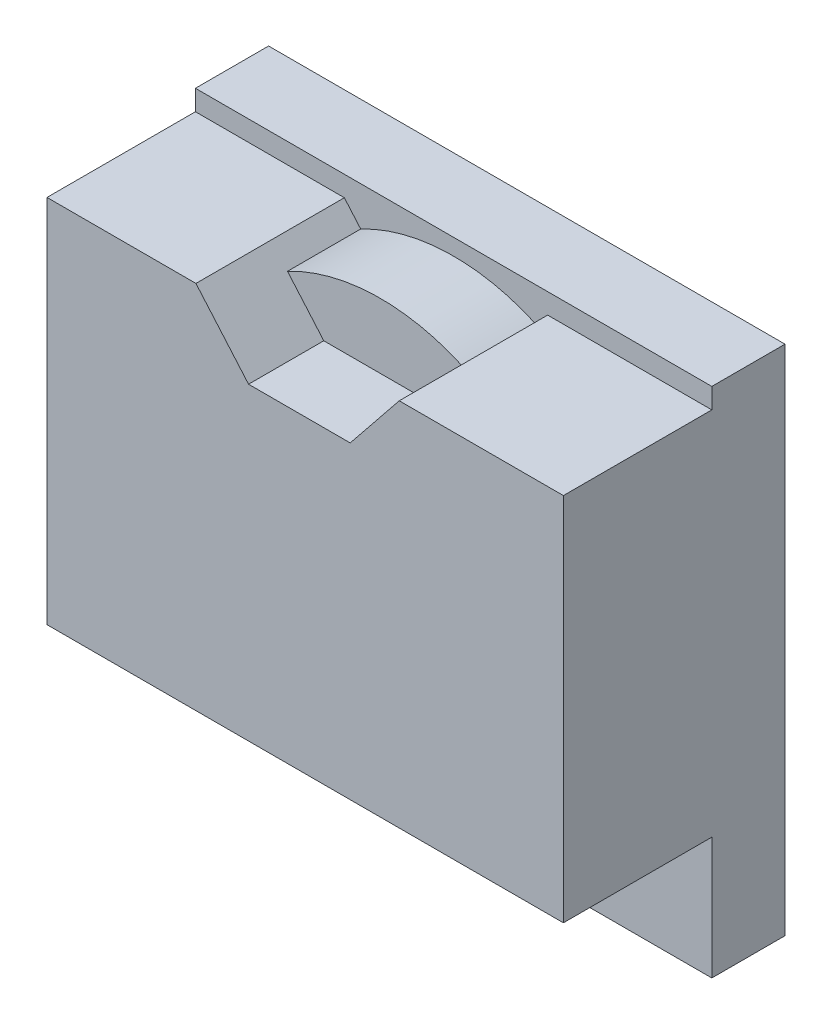
ISO-10303-21;
HEADER;
FILE_DESCRIPTION(('STEP AP214'),'2;1');
FILE_NAME('part.step','',(''),(''),'','','');
FILE_SCHEMA(('AUTOMOTIVE_DESIGN { 1 0 10303 214 1 1 1 1 }'));
ENDSEC;
DATA;
#1=APPLICATION_CONTEXT('core data for automotive mechanical design processes');
#2=APPLICATION_PROTOCOL_DEFINITION('international standard','automotive_design',2000,#1);
#3=PRODUCT_CONTEXT('',#1,'mechanical');
#4=PRODUCT('Part','Part','',(#3));
#5=PRODUCT_RELATED_PRODUCT_CATEGORY('part','',(#4));
#6=PRODUCT_DEFINITION_FORMATION('','',#4);
#7=PRODUCT_DEFINITION_CONTEXT('part definition',#1,'design');
#8=PRODUCT_DEFINITION('design','',#6,#7);
#9=PRODUCT_DEFINITION_SHAPE('','',#8);
#10=(LENGTH_UNIT() NAMED_UNIT(*) SI_UNIT(.MILLI.,.METRE.));
#11=(NAMED_UNIT(*) PLANE_ANGLE_UNIT() SI_UNIT($,.RADIAN.));
#12=(NAMED_UNIT(*) SI_UNIT($,.STERADIAN.) SOLID_ANGLE_UNIT());
#13=UNCERTAINTY_MEASURE_WITH_UNIT(LENGTH_MEASURE(1.E-05),#10,'distance_accuracy_value','');
#14=(GEOMETRIC_REPRESENTATION_CONTEXT(3) GLOBAL_UNCERTAINTY_ASSIGNED_CONTEXT((#13)) GLOBAL_UNIT_ASSIGNED_CONTEXT((#10,
#11,#12)) REPRESENTATION_CONTEXT('',''));
#15=CARTESIAN_POINT('',(0.,0.,0.));
#16=DIRECTION('',(0.,0.,1.));
#17=DIRECTION('',(1.,0.,0.));
#18=AXIS2_PLACEMENT_3D('',#15,#16,#17);
#19=CARTESIAN_POINT('',(6.35,-6.3,0.));
#20=DIRECTION('',(0.,-1.,0.));
#21=DIRECTION('',(0.,0.,-1.));
#22=AXIS2_PLACEMENT_3D('',#19,#20,#21);
#23=PLANE('',#22);
#24=DIRECTION('',(-1.,0.,0.));
#25=VECTOR('',#24,1.);
#26=CARTESIAN_POINT('',(-6.35,-6.3,0.9));
#27=LINE('',#26,#25);
#28=CARTESIAN_POINT('',(6.35,-6.3,0.9));
#29=VERTEX_POINT('',#28);
#30=CARTESIAN_POINT('',(-6.35,-6.3,0.9));
#31=VERTEX_POINT('',#30);
#32=EDGE_CURVE('E132',#29,#31,#27,.T.);
#33=ORIENTED_EDGE('',*,*,#32,.T.);
#34=DIRECTION('',(0.,0.,-1.));
#35=VECTOR('',#34,1.);
#36=CARTESIAN_POINT('',(-6.35,-6.3,0.));
#37=LINE('',#36,#35);
#38=CARTESIAN_POINT('',(-6.35,-6.3,-0.9));
#39=VERTEX_POINT('',#38);
#40=EDGE_CURVE('E124',#31,#39,#37,.T.);
#41=ORIENTED_EDGE('',*,*,#40,.T.);
#42=DIRECTION('',(1.,0.,0.));
#43=VECTOR('',#42,1.);
#44=CARTESIAN_POINT('',(-6.35,-6.3,-0.9));
#45=LINE('',#44,#43);
#46=CARTESIAN_POINT('',(6.35,-6.3,-0.9));
#47=VERTEX_POINT('',#46);
#48=EDGE_CURVE('E112',#39,#47,#45,.T.);
#49=ORIENTED_EDGE('',*,*,#48,.T.);
#50=DIRECTION('',(0.,0.,1.));
#51=VECTOR('',#50,1.);
#52=CARTESIAN_POINT('',(6.35,-6.3,0.));
#53=LINE('',#52,#51);
#54=EDGE_CURVE('E101',#47,#29,#53,.T.);
#55=ORIENTED_EDGE('',*,*,#54,.T.);
#56=EDGE_LOOP('',(#33,#41,#49,#55));
#57=FACE_BOUND('',#56,.T.);
#58=ADVANCED_FACE('F15',(#57),#23,.T.);
#59=CARTESIAN_POINT('',(-6.35,6.3,0.));
#60=DIRECTION('',(0.,1.,0.));
#61=DIRECTION('',(0.,0.,1.));
#62=AXIS2_PLACEMENT_3D('',#59,#60,#61);
#63=PLANE('',#62);
#64=DIRECTION('',(1.,0.,0.));
#65=VECTOR('',#64,1.);
#66=CARTESIAN_POINT('',(6.35,6.3,0.9));
#67=LINE('',#66,#65);
#68=CARTESIAN_POINT('',(-6.35,6.3,0.9));
#69=VERTEX_POINT('',#68);
#70=CARTESIAN_POINT('',(6.35,6.3,0.9));
#71=VERTEX_POINT('',#70);
#72=EDGE_CURVE('E35',#69,#71,#67,.T.);
#73=ORIENTED_EDGE('',*,*,#72,.T.);
#74=DIRECTION('',(0.,0.,1.));
#75=VECTOR('',#74,1.);
#76=CARTESIAN_POINT('',(6.35,6.3,0.));
#77=LINE('',#76,#75);
#78=CARTESIAN_POINT('',(6.35,6.3,-0.9));
#79=VERTEX_POINT('',#78);
#80=EDGE_CURVE('E19',#79,#71,#77,.T.);
#81=ORIENTED_EDGE('',*,*,#80,.F.);
#82=DIRECTION('',(-1.,0.,0.));
#83=VECTOR('',#82,1.);
#84=CARTESIAN_POINT('',(6.35,6.3,-0.9));
#85=LINE('',#84,#83);
#86=CARTESIAN_POINT('',(-6.35,6.3,-0.9));
#87=VERTEX_POINT('',#86);
#88=EDGE_CURVE('E94',#79,#87,#85,.T.);
#89=ORIENTED_EDGE('',*,*,#88,.T.);
#90=DIRECTION('',(0.,0.,1.));
#91=VECTOR('',#90,1.);
#92=CARTESIAN_POINT('',(-6.35,6.3,0.));
#93=LINE('',#92,#91);
#94=EDGE_CURVE('E165',#87,#69,#93,.T.);
#95=ORIENTED_EDGE('',*,*,#94,.T.);
#96=EDGE_LOOP('',(#73,#81,#89,#95));
#97=FACE_BOUND('',#96,.T.);
#98=ADVANCED_FACE('F93',(#97),#63,.T.);
#99=CARTESIAN_POINT('',(0.,1.,2.7));
#100=DIRECTION('',(0.,0.,-1.));
#101=DIRECTION('',(-1.,0.,0.));
#102=AXIS2_PLACEMENT_3D('',#99,#100,#101);
#103=PLANE('',#102);
#104=DIRECTION('',(-1.,0.,0.));
#105=VECTOR('',#104,1.);
#106=CARTESIAN_POINT('',(3.175,-3.3,2.7));
#107=LINE('',#106,#105);
#108=CARTESIAN_POINT('',(2.34946802489415,-3.3,2.7));
#109=VERTEX_POINT('',#108);
#110=CARTESIAN_POINT('',(-2.34946802489415,-3.3,2.7));
#111=VERTEX_POINT('',#110);
#112=EDGE_CURVE('E142',#109,#111,#107,.T.);
#113=ORIENTED_EDGE('',*,*,#112,.T.);
#114=CARTESIAN_POINT('',(0.,1.,2.7));
#115=DIRECTION('',(0.,0.,-1.));
#116=DIRECTION('',(-1.,0.,0.));
#117=AXIS2_PLACEMENT_3D('',#114,#115,#116);
#118=CIRCLE('',#117,4.9);
#119=EDGE_CURVE('E10',#109,#111,#118,.T.);
#120=ORIENTED_EDGE('',*,*,#119,.F.);
#121=EDGE_LOOP('',(#113,#120));
#122=FACE_BOUND('',#121,.T.);
#123=ADVANCED_FACE('F337',(#122),#103,.F.);
#124=CARTESIAN_POINT('',(0.,1.,0.9));
#125=DIRECTION('',(0.,0.,-1.));
#126=DIRECTION('',(-1.,0.,0.));
#127=AXIS2_PLACEMENT_3D('',#124,#125,#126);
#128=CYLINDRICAL_SURFACE('',#127,4.9);
#129=DIRECTION('',(0.,0.,-1.));
#130=VECTOR('',#129,1.);
#131=CARTESIAN_POINT('',(-2.34946802489415,-3.3,0.9));
#132=LINE('',#131,#130);
#133=CARTESIAN_POINT('',(-2.34946802489415,-3.3,0.9));
#134=VERTEX_POINT('',#133);
#135=EDGE_CURVE('E139',#111,#134,#132,.T.);
#136=ORIENTED_EDGE('',*,*,#135,.T.);
#137=CARTESIAN_POINT('',(0.,1.,0.9));
#138=DIRECTION('',(0.,0.,-1.));
#139=DIRECTION('',(-1.,0.,0.));
#140=AXIS2_PLACEMENT_3D('',#137,#138,#139);
#141=CIRCLE('',#140,4.9);
#142=CARTESIAN_POINT('',(2.34946802489415,-3.3,0.9));
#143=VERTEX_POINT('',#142);
#144=EDGE_CURVE('E26',#143,#134,#141,.T.);
#145=ORIENTED_EDGE('',*,*,#144,.F.);
#146=DIRECTION('',(0.,0.,1.));
#147=VECTOR('',#146,1.);
#148=CARTESIAN_POINT('',(2.34946802489415,-3.3,0.9));
#149=LINE('',#148,#147);
#150=EDGE_CURVE('E137',#143,#109,#149,.T.);
#151=ORIENTED_EDGE('',*,*,#150,.T.);
#152=ORIENTED_EDGE('',*,*,#119,.T.);
#153=EDGE_LOOP('',(#136,#145,#151,#152));
#154=FACE_BOUND('',#153,.T.);
#155=ADVANCED_FACE('F335',(#154),#128,.T.);
#156=CARTESIAN_POINT('',(0.,1.,0.9));
#157=DIRECTION('',(0.,0.,-1.));
#158=DIRECTION('',(-1.,0.,0.));
#159=AXIS2_PLACEMENT_3D('',#156,#157,#158);
#160=CYLINDRICAL_SURFACE('',#159,4.9);
#161=DIRECTION('',(0.,0.,1.));
#162=VECTOR('',#161,1.);
#163=CARTESIAN_POINT('',(-2.28537212553272,5.33440587022467,0.9));
#164=LINE('',#163,#162);
#165=CARTESIAN_POINT('',(-2.28537212553272,5.33440587022467,0.9));
#166=VERTEX_POINT('',#165);
#167=CARTESIAN_POINT('',(-2.28537212553272,5.33440587022467,2.7));
#168=VERTEX_POINT('',#167);
#169=EDGE_CURVE('E169',#166,#168,#164,.T.);
#170=ORIENTED_EDGE('',*,*,#169,.T.);
#171=CARTESIAN_POINT('',(0.,1.,2.7));
#172=DIRECTION('',(0.,0.,-1.));
#173=DIRECTION('',(-1.,0.,0.));
#174=AXIS2_PLACEMENT_3D('',#171,#172,#173);
#175=CIRCLE('',#174,4.9);
#176=CARTESIAN_POINT('',(2.03686712567783,5.45658751875613,2.7));
#177=VERTEX_POINT('',#176);
#178=EDGE_CURVE('E150',#168,#177,#175,.T.);
#179=ORIENTED_EDGE('',*,*,#178,.T.);
#180=DIRECTION('',(0.,0.,-1.));
#181=VECTOR('',#180,1.);
#182=CARTESIAN_POINT('',(2.03686712567783,5.45658751875613,0.9));
#183=LINE('',#182,#181);
#184=CARTESIAN_POINT('',(2.03686712567783,5.45658751875613,0.9));
#185=VERTEX_POINT('',#184);
#186=EDGE_CURVE('E175',#177,#185,#183,.T.);
#187=ORIENTED_EDGE('',*,*,#186,.T.);
#188=CARTESIAN_POINT('',(0.,1.,0.9));
#189=DIRECTION('',(0.,0.,-1.));
#190=DIRECTION('',(-1.,0.,0.));
#191=AXIS2_PLACEMENT_3D('',#188,#189,#190);
#192=CIRCLE('',#191,4.9);
#193=EDGE_CURVE('E133',#166,#185,#192,.T.);
#194=ORIENTED_EDGE('',*,*,#193,.F.);
#195=EDGE_LOOP('',(#170,#179,#187,#194));
#196=FACE_BOUND('',#195,.T.);
#197=ADVANCED_FACE('F206',(#196),#160,.T.);
#198=CARTESIAN_POINT('',(0.,0.,0.9));
#199=DIRECTION('',(0.,0.,1.));
#200=DIRECTION('',(1.,0.,0.));
#201=AXIS2_PLACEMENT_3D('',#198,#199,#200);
#202=PLANE('',#201);
#203=DIRECTION('',(-1.,0.,0.));
#204=VECTOR('',#203,1.);
#205=CARTESIAN_POINT('',(3.175,-3.3,0.9));
#206=LINE('',#205,#204);
#207=CARTESIAN_POINT('',(-6.35,-3.3,0.9));
#208=VERTEX_POINT('',#207);
#209=EDGE_CURVE('E143',#134,#208,#206,.T.);
#210=ORIENTED_EDGE('',*,*,#209,.T.);
#211=DIRECTION('',(0.,1.,0.));
#212=VECTOR('',#211,1.);
#213=CARTESIAN_POINT('',(-6.35,6.3,0.9));
#214=LINE('',#213,#212);
#215=EDGE_CURVE('E118',#31,#208,#214,.T.);
#216=ORIENTED_EDGE('',*,*,#215,.F.);
#217=ORIENTED_EDGE('',*,*,#32,.F.);
#218=DIRECTION('',(0.,-1.,0.));
#219=VECTOR('',#218,1.);
#220=CARTESIAN_POINT('',(6.35,-6.3,0.9));
#221=LINE('',#220,#219);
#222=CARTESIAN_POINT('',(6.35,-3.3,0.9));
#223=VERTEX_POINT('',#222);
#224=EDGE_CURVE('E111',#223,#29,#221,.T.);
#225=ORIENTED_EDGE('',*,*,#224,.F.);
#226=DIRECTION('',(-1.,0.,0.));
#227=VECTOR('',#226,1.);
#228=CARTESIAN_POINT('',(3.175,-3.3,0.9));
#229=LINE('',#228,#227);
#230=EDGE_CURVE('E134',#223,#143,#229,.T.);
#231=ORIENTED_EDGE('',*,*,#230,.T.);
#232=ORIENTED_EDGE('',*,*,#144,.T.);
#233=EDGE_LOOP('',(#210,#216,#217,#225,#231,#232));
#234=FACE_BOUND('',#233,.T.);
#235=ADVANCED_FACE('F320',(#234),#202,.T.);
#236=CARTESIAN_POINT('',(0.,0.,0.9));
#237=DIRECTION('',(0.,0.,1.));
#238=DIRECTION('',(1.,0.,0.));
#239=AXIS2_PLACEMENT_3D('',#236,#237,#238);
#240=PLANE('',#239);
#241=DIRECTION('',(1.,0.,0.));
#242=VECTOR('',#241,1.);
#243=CARTESIAN_POINT('',(-3.175,5.8,0.9));
#244=LINE('',#243,#242);
#245=CARTESIAN_POINT('',(-6.35,5.8,0.9));
#246=VERTEX_POINT('',#245);
#247=CARTESIAN_POINT('',(-2.68704210642177,5.8,0.9));
#248=VERTEX_POINT('',#247);
#249=EDGE_CURVE('E156',#246,#248,#244,.T.);
#250=ORIENTED_EDGE('',*,*,#249,.T.);
#251=DIRECTION('',(0.6532154751856,-0.757172069597163,0.));
#252=VECTOR('',#251,1.);
#253=CARTESIAN_POINT('',(-0.679444605815001,3.47290149698212,0.9));
#254=LINE('',#253,#252);
#255=EDGE_CURVE('E148',#248,#166,#254,.T.);
#256=ORIENTED_EDGE('',*,*,#255,.T.);
#257=ORIENTED_EDGE('',*,*,#193,.T.);
#258=DIRECTION('',(0.626576303795427,0.779360080785551,0.));
#259=VECTOR('',#258,1.);
#260=CARTESIAN_POINT('',(-0.160197990514233,2.72379210968235,0.9));
#261=LINE('',#260,#259);
#262=CARTESIAN_POINT('',(2.31295789357823,5.8,0.9));
#263=VERTEX_POINT('',#262);
#264=EDGE_CURVE('E172',#185,#263,#261,.T.);
#265=ORIENTED_EDGE('',*,*,#264,.T.);
#266=DIRECTION('',(1.,0.,0.));
#267=VECTOR('',#266,1.);
#268=CARTESIAN_POINT('',(1.15647894678911,5.8,0.9));
#269=LINE('',#268,#267);
#270=CARTESIAN_POINT('',(6.35,5.8,0.9));
#271=VERTEX_POINT('',#270);
#272=EDGE_CURVE('E222',#263,#271,#269,.T.);
#273=ORIENTED_EDGE('',*,*,#272,.T.);
#274=DIRECTION('',(0.,-1.,0.));
#275=VECTOR('',#274,1.);
#276=CARTESIAN_POINT('',(6.35,-6.3,0.9));
#277=LINE('',#276,#275);
#278=EDGE_CURVE('E100',#71,#271,#277,.T.);
#279=ORIENTED_EDGE('',*,*,#278,.F.);
#280=ORIENTED_EDGE('',*,*,#72,.F.);
#281=DIRECTION('',(0.,1.,0.));
#282=VECTOR('',#281,1.);
#283=CARTESIAN_POINT('',(-6.35,6.3,0.9));
#284=LINE('',#283,#282);
#285=EDGE_CURVE('E161',#246,#69,#284,.T.);
#286=ORIENTED_EDGE('',*,*,#285,.F.);
#287=EDGE_LOOP('',(#250,#256,#257,#265,#273,#279,#280,#286));
#288=FACE_BOUND('',#287,.T.);
#289=ADVANCED_FACE('F197',(#288),#240,.T.);
#290=CARTESIAN_POINT('',(0.,1.,2.7));
#291=DIRECTION('',(0.,0.,-1.));
#292=DIRECTION('',(-1.,0.,0.));
#293=AXIS2_PLACEMENT_3D('',#290,#291,#292);
#294=PLANE('',#293);
#295=DIRECTION('',(0.6532154751856,-0.757172069597163,0.));
#296=VECTOR('',#295,1.);
#297=CARTESIAN_POINT('',(-0.926742862434589,3.75955626847115,2.7));
#298=LINE('',#297,#296);
#299=CARTESIAN_POINT('',(-1.39298590424345,4.3,2.7));
#300=VERTEX_POINT('',#299);
#301=EDGE_CURVE('E167',#168,#300,#298,.T.);
#302=ORIENTED_EDGE('',*,*,#301,.T.);
#303=DIRECTION('',(1.,0.,0.));
#304=VECTOR('',#303,1.);
#305=CARTESIAN_POINT('',(-0.696492952121728,4.3,2.7));
#306=LINE('',#305,#304);
#307=CARTESIAN_POINT('',(1.10701409575654,4.3,2.7));
#308=VERTEX_POINT('',#307);
#309=EDGE_CURVE('E128',#300,#308,#306,.T.);
#310=ORIENTED_EDGE('',*,*,#309,.T.);
#311=DIRECTION('',(0.626576303795427,0.779360080785551,0.));
#312=VECTOR('',#311,1.);
#313=CARTESIAN_POINT('',(0.0839662888579251,3.02749317744338,2.7));
#314=LINE('',#313,#312);
#315=EDGE_CURVE('E210',#308,#177,#314,.T.);
#316=ORIENTED_EDGE('',*,*,#315,.T.);
#317=ORIENTED_EDGE('',*,*,#178,.F.);
#318=EDGE_LOOP('',(#302,#310,#316,#317));
#319=FACE_BOUND('',#318,.T.);
#320=ADVANCED_FACE('F267',(#319),#294,.F.);
#321=CARTESIAN_POINT('',(6.35,6.3,0.));
#322=DIRECTION('',(1.,0.,0.));
#323=DIRECTION('',(0.,0.,-1.));
#324=AXIS2_PLACEMENT_3D('',#321,#322,#323);
#325=PLANE('',#324);
#326=ORIENTED_EDGE('',*,*,#224,.T.);
#327=ORIENTED_EDGE('',*,*,#54,.F.);
#328=DIRECTION('',(0.,1.,0.));
#329=VECTOR('',#328,1.);
#330=CARTESIAN_POINT('',(6.35,-6.3,-0.9));
#331=LINE('',#330,#329);
#332=EDGE_CURVE('E106',#47,#79,#331,.T.);
#333=ORIENTED_EDGE('',*,*,#332,.T.);
#334=ORIENTED_EDGE('',*,*,#80,.T.);
#335=ORIENTED_EDGE('',*,*,#278,.T.);
#336=DIRECTION('',(0.,0.,1.));
#337=VECTOR('',#336,1.);
#338=CARTESIAN_POINT('',(6.35,5.8,-0.9));
#339=LINE('',#338,#337);
#340=CARTESIAN_POINT('',(6.35,5.8,4.55));
#341=VERTEX_POINT('',#340);
#342=EDGE_CURVE('E176',#271,#341,#339,.T.);
#343=ORIENTED_EDGE('',*,*,#342,.T.);
#344=DIRECTION('',(0.,-1.,0.));
#345=VECTOR('',#344,1.);
#346=CARTESIAN_POINT('',(6.35,5.8,4.55));
#347=LINE('',#346,#345);
#348=CARTESIAN_POINT('',(6.35,-3.3,4.55));
#349=VERTEX_POINT('',#348);
#350=EDGE_CURVE('E240',#341,#349,#347,.T.);
#351=ORIENTED_EDGE('',*,*,#350,.T.);
#352=DIRECTION('',(0.,0.,1.));
#353=VECTOR('',#352,1.);
#354=CARTESIAN_POINT('',(6.35,-3.3,-0.9));
#355=LINE('',#354,#353);
#356=EDGE_CURVE('E136',#223,#349,#355,.T.);
#357=ORIENTED_EDGE('',*,*,#356,.F.);
#358=EDGE_LOOP('',(#326,#327,#333,#334,#335,#343,#351,#357));
#359=FACE_BOUND('',#358,.T.);
#360=ADVANCED_FACE('F115',(#359),#325,.T.);
#361=CARTESIAN_POINT('',(0.,0.,-0.9));
#362=DIRECTION('',(0.,0.,1.));
#363=DIRECTION('',(1.,0.,0.));
#364=AXIS2_PLACEMENT_3D('',#361,#362,#363);
#365=PLANE('',#364);
#366=ORIENTED_EDGE('',*,*,#332,.F.);
#367=ORIENTED_EDGE('',*,*,#48,.F.);
#368=DIRECTION('',(0.,-1.,0.));
#369=VECTOR('',#368,1.);
#370=CARTESIAN_POINT('',(-6.35,6.3,-0.9));
#371=LINE('',#370,#369);
#372=EDGE_CURVE('E108',#87,#39,#371,.T.);
#373=ORIENTED_EDGE('',*,*,#372,.F.);
#374=ORIENTED_EDGE('',*,*,#88,.F.);
#375=EDGE_LOOP('',(#366,#367,#373,#374));
#376=FACE_BOUND('',#375,.T.);
#377=ADVANCED_FACE('F104',(#376),#365,.F.);
#378=CARTESIAN_POINT('',(-6.35,-6.3,0.));
#379=DIRECTION('',(-1.,0.,0.));
#380=DIRECTION('',(0.,0.,1.));
#381=AXIS2_PLACEMENT_3D('',#378,#379,#380);
#382=PLANE('',#381);
#383=ORIENTED_EDGE('',*,*,#285,.T.);
#384=ORIENTED_EDGE('',*,*,#94,.F.);
#385=ORIENTED_EDGE('',*,*,#372,.T.);
#386=ORIENTED_EDGE('',*,*,#40,.F.);
#387=ORIENTED_EDGE('',*,*,#215,.T.);
#388=DIRECTION('',(0.,0.,1.));
#389=VECTOR('',#388,1.);
#390=CARTESIAN_POINT('',(-6.35,-3.3,-0.9));
#391=LINE('',#390,#389);
#392=CARTESIAN_POINT('',(-6.35,-3.3,4.55));
#393=VERTEX_POINT('',#392);
#394=EDGE_CURVE('E227',#208,#393,#391,.T.);
#395=ORIENTED_EDGE('',*,*,#394,.T.);
#396=DIRECTION('',(0.,1.,0.));
#397=VECTOR('',#396,1.);
#398=CARTESIAN_POINT('',(-6.35,-3.3,4.55));
#399=LINE('',#398,#397);
#400=CARTESIAN_POINT('',(-6.35,5.8,4.55));
#401=VERTEX_POINT('',#400);
#402=EDGE_CURVE('E166',#393,#401,#399,.T.);
#403=ORIENTED_EDGE('',*,*,#402,.T.);
#404=DIRECTION('',(0.,0.,1.));
#405=VECTOR('',#404,1.);
#406=CARTESIAN_POINT('',(-6.35,5.8,-0.9));
#407=LINE('',#406,#405);
#408=EDGE_CURVE('E159',#246,#401,#407,.T.);
#409=ORIENTED_EDGE('',*,*,#408,.F.);
#410=EDGE_LOOP('',(#383,#384,#385,#386,#387,#395,#403,#409));
#411=FACE_BOUND('',#410,.T.);
#412=ADVANCED_FACE('F316',(#411),#382,.T.);
#413=CARTESIAN_POINT('',(-0.00383286462663064,1.24370533152266,4.55));
#414=DIRECTION('',(0.,0.,1.));
#415=DIRECTION('',(1.,0.,0.));
#416=AXIS2_PLACEMENT_3D('',#413,#414,#415);
#417=PLANE('',#416);
#418=DIRECTION('',(-1.,0.,0.));
#419=VECTOR('',#418,1.);
#420=CARTESIAN_POINT('',(6.35,-3.3,4.55));
#421=LINE('',#420,#419);
#422=EDGE_CURVE('E180',#349,#393,#421,.T.);
#423=ORIENTED_EDGE('',*,*,#422,.F.);
#424=ORIENTED_EDGE('',*,*,#350,.F.);
#425=DIRECTION('',(1.,0.,0.));
#426=VECTOR('',#425,1.);
#427=CARTESIAN_POINT('',(-6.35,5.8,4.55));
#428=LINE('',#427,#426);
#429=CARTESIAN_POINT('',(2.31295789357823,5.8,4.55));
#430=VERTEX_POINT('',#429);
#431=EDGE_CURVE('E184',#430,#341,#428,.T.);
#432=ORIENTED_EDGE('',*,*,#431,.F.);
#433=DIRECTION('',(0.626576303795427,0.779360080785551,0.));
#434=VECTOR('',#433,1.);
#435=CARTESIAN_POINT('',(1.10701409575654,4.3,4.55));
#436=LINE('',#435,#434);
#437=CARTESIAN_POINT('',(1.10701409575654,4.3,4.55));
#438=VERTEX_POINT('',#437);
#439=EDGE_CURVE('E160',#438,#430,#436,.T.);
#440=ORIENTED_EDGE('',*,*,#439,.F.);
#441=DIRECTION('',(1.,0.,0.));
#442=VECTOR('',#441,1.);
#443=CARTESIAN_POINT('',(-1.39298590424345,4.3,4.55));
#444=LINE('',#443,#442);
#445=CARTESIAN_POINT('',(-1.39298590424345,4.3,4.55));
#446=VERTEX_POINT('',#445);
#447=EDGE_CURVE('E237',#446,#438,#444,.T.);
#448=ORIENTED_EDGE('',*,*,#447,.F.);
#449=DIRECTION('',(0.6532154751856,-0.757172069597163,0.));
#450=VECTOR('',#449,1.);
#451=CARTESIAN_POINT('',(-2.68704210642177,5.8,4.55));
#452=LINE('',#451,#450);
#453=CARTESIAN_POINT('',(-2.68704210642177,5.8,4.55));
#454=VERTEX_POINT('',#453);
#455=EDGE_CURVE('E244',#454,#446,#452,.T.);
#456=ORIENTED_EDGE('',*,*,#455,.F.);
#457=DIRECTION('',(1.,0.,0.));
#458=VECTOR('',#457,1.);
#459=CARTESIAN_POINT('',(-6.35,5.8,4.55));
#460=LINE('',#459,#458);
#461=EDGE_CURVE('E149',#401,#454,#460,.T.);
#462=ORIENTED_EDGE('',*,*,#461,.F.);
#463=ORIENTED_EDGE('',*,*,#402,.F.);
#464=EDGE_LOOP('',(#423,#424,#432,#440,#448,#456,#462,#463));
#465=FACE_BOUND('',#464,.T.);
#466=ADVANCED_FACE('F293',(#465),#417,.T.);
#467=CARTESIAN_POINT('',(-1.39298590424345,4.3,-0.9));
#468=DIRECTION('',(0.,1.,0.));
#469=DIRECTION('',(0.,0.,1.));
#470=AXIS2_PLACEMENT_3D('',#467,#468,#469);
#471=PLANE('',#470);
#472=ORIENTED_EDGE('',*,*,#309,.F.);
#473=DIRECTION('',(0.,0.,1.));
#474=VECTOR('',#473,1.);
#475=CARTESIAN_POINT('',(-1.39298590424345,4.3,-0.9));
#476=LINE('',#475,#474);
#477=EDGE_CURVE('E170',#300,#446,#476,.T.);
#478=ORIENTED_EDGE('',*,*,#477,.T.);
#479=ORIENTED_EDGE('',*,*,#447,.T.);
#480=DIRECTION('',(0.,0.,1.));
#481=VECTOR('',#480,1.);
#482=CARTESIAN_POINT('',(1.10701409575654,4.3,-0.9));
#483=LINE('',#482,#481);
#484=EDGE_CURVE('E191',#308,#438,#483,.T.);
#485=ORIENTED_EDGE('',*,*,#484,.F.);
#486=EDGE_LOOP('',(#472,#478,#479,#485));
#487=FACE_BOUND('',#486,.T.);
#488=ADVANCED_FACE('F17',(#487),#471,.T.);
#489=CARTESIAN_POINT('',(-2.68704210642177,5.8,-0.9));
#490=DIRECTION('',(0.757172069597163,0.6532154751856,0.));
#491=DIRECTION('',(0.,0.,-1.));
#492=AXIS2_PLACEMENT_3D('',#489,#490,#491);
#493=PLANE('',#492);
#494=ORIENTED_EDGE('',*,*,#255,.F.);
#495=DIRECTION('',(0.,0.,1.));
#496=VECTOR('',#495,1.);
#497=CARTESIAN_POINT('',(-2.68704210642177,5.8,-0.9));
#498=LINE('',#497,#496);
#499=EDGE_CURVE('E144',#248,#454,#498,.T.);
#500=ORIENTED_EDGE('',*,*,#499,.T.);
#501=ORIENTED_EDGE('',*,*,#455,.T.);
#502=ORIENTED_EDGE('',*,*,#477,.F.);
#503=ORIENTED_EDGE('',*,*,#301,.F.);
#504=ORIENTED_EDGE('',*,*,#169,.F.);
#505=EDGE_LOOP('',(#494,#500,#501,#502,#503,#504));
#506=FACE_BOUND('',#505,.T.);
#507=ADVANCED_FACE('F301',(#506),#493,.T.);
#508=CARTESIAN_POINT('',(-6.35,5.8,-0.9));
#509=DIRECTION('',(0.,1.,0.));
#510=DIRECTION('',(0.,0.,1.));
#511=AXIS2_PLACEMENT_3D('',#508,#509,#510);
#512=PLANE('',#511);
#513=ORIENTED_EDGE('',*,*,#249,.F.);
#514=ORIENTED_EDGE('',*,*,#408,.T.);
#515=ORIENTED_EDGE('',*,*,#461,.T.);
#516=ORIENTED_EDGE('',*,*,#499,.F.);
#517=EDGE_LOOP('',(#513,#514,#515,#516));
#518=FACE_BOUND('',#517,.T.);
#519=ADVANCED_FACE('F331',(#518),#512,.T.);
#520=CARTESIAN_POINT('',(1.10701409575654,4.3,-0.9));
#521=DIRECTION('',(-0.779360080785551,0.626576303795427,0.));
#522=DIRECTION('',(0.,0.,1.));
#523=AXIS2_PLACEMENT_3D('',#520,#521,#522);
#524=PLANE('',#523);
#525=ORIENTED_EDGE('',*,*,#264,.F.);
#526=ORIENTED_EDGE('',*,*,#186,.F.);
#527=ORIENTED_EDGE('',*,*,#315,.F.);
#528=ORIENTED_EDGE('',*,*,#484,.T.);
#529=ORIENTED_EDGE('',*,*,#439,.T.);
#530=DIRECTION('',(0.,0.,1.));
#531=VECTOR('',#530,1.);
#532=CARTESIAN_POINT('',(2.31295789357823,5.8,-0.9));
#533=LINE('',#532,#531);
#534=EDGE_CURVE('E188',#263,#430,#533,.T.);
#535=ORIENTED_EDGE('',*,*,#534,.F.);
#536=EDGE_LOOP('',(#525,#526,#527,#528,#529,#535));
#537=FACE_BOUND('',#536,.T.);
#538=ADVANCED_FACE('F212',(#537),#524,.T.);
#539=CARTESIAN_POINT('',(2.31295789357823,5.8,-0.9));
#540=DIRECTION('',(0.,1.,0.));
#541=DIRECTION('',(0.,0.,1.));
#542=AXIS2_PLACEMENT_3D('',#539,#540,#541);
#543=PLANE('',#542);
#544=ORIENTED_EDGE('',*,*,#272,.F.);
#545=ORIENTED_EDGE('',*,*,#534,.T.);
#546=ORIENTED_EDGE('',*,*,#431,.T.);
#547=ORIENTED_EDGE('',*,*,#342,.F.);
#548=EDGE_LOOP('',(#544,#545,#546,#547));
#549=FACE_BOUND('',#548,.T.);
#550=ADVANCED_FACE('F225',(#549),#543,.T.);
#551=CARTESIAN_POINT('',(6.35,-3.3,-0.9));
#552=DIRECTION('',(0.,-1.,0.));
#553=DIRECTION('',(0.,0.,-1.));
#554=AXIS2_PLACEMENT_3D('',#551,#552,#553);
#555=PLANE('',#554);
#556=ORIENTED_EDGE('',*,*,#209,.F.);
#557=ORIENTED_EDGE('',*,*,#135,.F.);
#558=ORIENTED_EDGE('',*,*,#112,.F.);
#559=ORIENTED_EDGE('',*,*,#150,.F.);
#560=ORIENTED_EDGE('',*,*,#230,.F.);
#561=ORIENTED_EDGE('',*,*,#356,.T.);
#562=ORIENTED_EDGE('',*,*,#422,.T.);
#563=ORIENTED_EDGE('',*,*,#394,.F.);
#564=EDGE_LOOP('',(#556,#557,#558,#559,#560,#561,#562,#563));
#565=FACE_BOUND('',#564,.T.);
#566=ADVANCED_FACE('F324',(#565),#555,.T.);
#567=CLOSED_SHELL('',(#58,#98,#123,#155,#197,#235,#289,#320,#360,#377,#412,#466,#488,#507,#519,
#538,#550,#566));
#568=MANIFOLD_SOLID_BREP('B1',#567);
#569=ADVANCED_BREP_SHAPE_REPRESENTATION('',(#18,#568),#14);
#570=SHAPE_DEFINITION_REPRESENTATION(#9,#569);
ENDSEC;
END-ISO-10303-21;
